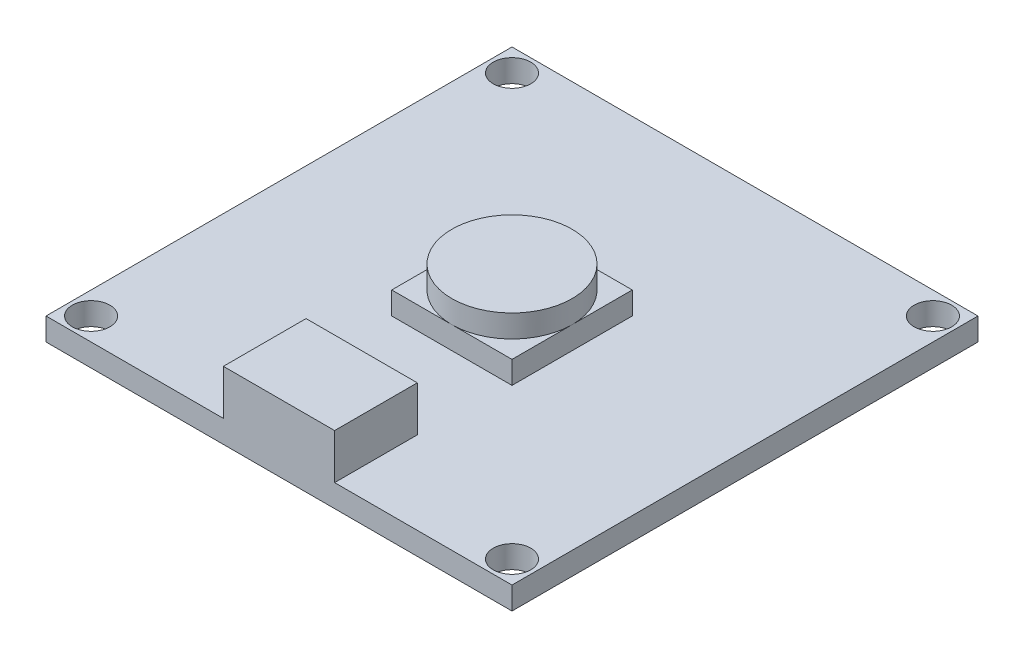
ISO-10303-21;
HEADER;
FILE_DESCRIPTION(('STEP AP214'),'2;1');
FILE_NAME('part.step','',(''),(''),'','','');
FILE_SCHEMA(('AUTOMOTIVE_DESIGN { 1 0 10303 214 1 1 1 1 }'));
ENDSEC;
DATA;
#1=APPLICATION_CONTEXT('core data for automotive mechanical design processes');
#2=APPLICATION_PROTOCOL_DEFINITION('international standard','automotive_design',2000,#1);
#3=PRODUCT_CONTEXT('',#1,'mechanical');
#4=PRODUCT('Part','Part','',(#3));
#5=PRODUCT_RELATED_PRODUCT_CATEGORY('part','',(#4));
#6=PRODUCT_DEFINITION_FORMATION('','',#4);
#7=PRODUCT_DEFINITION_CONTEXT('part definition',#1,'design');
#8=PRODUCT_DEFINITION('design','',#6,#7);
#9=PRODUCT_DEFINITION_SHAPE('','',#8);
#10=(LENGTH_UNIT() NAMED_UNIT(*) SI_UNIT(.MILLI.,.METRE.));
#11=(NAMED_UNIT(*) PLANE_ANGLE_UNIT() SI_UNIT($,.RADIAN.));
#12=(NAMED_UNIT(*) SI_UNIT($,.STERADIAN.) SOLID_ANGLE_UNIT());
#13=UNCERTAINTY_MEASURE_WITH_UNIT(LENGTH_MEASURE(1.E-05),#10,'distance_accuracy_value','');
#14=(GEOMETRIC_REPRESENTATION_CONTEXT(3) GLOBAL_UNCERTAINTY_ASSIGNED_CONTEXT((#13)) GLOBAL_UNIT_ASSIGNED_CONTEXT((#10,
#11,#12)) REPRESENTATION_CONTEXT('',''));
#15=CARTESIAN_POINT('',(0.,0.,0.));
#16=DIRECTION('',(0.,0.,1.));
#17=DIRECTION('',(1.,0.,0.));
#18=AXIS2_PLACEMENT_3D('',#15,#16,#17);
#19=CARTESIAN_POINT('',(0.,1.5,0.));
#20=DIRECTION('',(0.,-1.,0.));
#21=DIRECTION('',(0.,0.,-1.));
#22=AXIS2_PLACEMENT_3D('',#19,#20,#21);
#23=PLANE('',#22);
#24=CARTESIAN_POINT('',(-14.,1.5,14.));
#25=DIRECTION('',(0.,1.,0.));
#26=DIRECTION('',(0.,0.,1.));
#27=AXIS2_PLACEMENT_3D('',#24,#25,#26);
#28=CIRCLE('',#27,1.25);
#29=CARTESIAN_POINT('',(-14.,1.5,15.25));
#30=VERTEX_POINT('',#29);
#31=EDGE_CURVE('E347',#30,#30,#28,.T.);
#32=ORIENTED_EDGE('',*,*,#31,.F.);
#33=EDGE_LOOP('',(#32));
#34=FACE_BOUND('',#33,.T.);
#35=CARTESIAN_POINT('',(14.,1.5,14.));
#36=DIRECTION('',(0.,1.,0.));
#37=DIRECTION('',(0.,0.,1.));
#38=AXIS2_PLACEMENT_3D('',#35,#36,#37);
#39=CIRCLE('',#38,1.25);
#40=CARTESIAN_POINT('',(14.,1.5,15.25));
#41=VERTEX_POINT('',#40);
#42=EDGE_CURVE('E353',#41,#41,#39,.T.);
#43=ORIENTED_EDGE('',*,*,#42,.F.);
#44=EDGE_LOOP('',(#43));
#45=FACE_BOUND('',#44,.T.);
#46=CARTESIAN_POINT('',(14.,1.5,-14.));
#47=DIRECTION('',(0.,1.,0.));
#48=DIRECTION('',(0.,0.,1.));
#49=AXIS2_PLACEMENT_3D('',#46,#47,#48);
#50=CIRCLE('',#49,1.25);
#51=CARTESIAN_POINT('',(14.,1.5,-12.75));
#52=VERTEX_POINT('',#51);
#53=EDGE_CURVE('E359',#52,#52,#50,.T.);
#54=ORIENTED_EDGE('',*,*,#53,.F.);
#55=EDGE_LOOP('',(#54));
#56=FACE_BOUND('',#55,.T.);
#57=CARTESIAN_POINT('',(-14.,1.5,-14.));
#58=DIRECTION('',(0.,1.,0.));
#59=DIRECTION('',(0.,0.,1.));
#60=AXIS2_PLACEMENT_3D('',#57,#58,#59);
#61=CIRCLE('',#60,1.25);
#62=CARTESIAN_POINT('',(-14.,1.5,-12.75));
#63=VERTEX_POINT('',#62);
#64=EDGE_CURVE('E339',#63,#63,#61,.T.);
#65=ORIENTED_EDGE('',*,*,#64,.F.);
#66=EDGE_LOOP('',(#65));
#67=FACE_BOUND('',#66,.T.);
#68=DIRECTION('',(0.,0.,-1.));
#69=VECTOR('',#68,1.);
#70=CARTESIAN_POINT('',(4.,1.5,4.));
#71=LINE('',#70,#69);
#72=CARTESIAN_POINT('',(4.,1.5,4.));
#73=VERTEX_POINT('',#72);
#74=CARTESIAN_POINT('',(4.,1.5,-4.));
#75=VERTEX_POINT('',#74);
#76=EDGE_CURVE('E174',#73,#75,#71,.T.);
#77=ORIENTED_EDGE('',*,*,#76,.F.);
#78=DIRECTION('',(1.,0.,0.));
#79=VECTOR('',#78,1.);
#80=CARTESIAN_POINT('',(-4.,1.5,4.));
#81=LINE('',#80,#79);
#82=CARTESIAN_POINT('',(-4.,1.5,4.));
#83=VERTEX_POINT('',#82);
#84=EDGE_CURVE('E200',#83,#73,#81,.T.);
#85=ORIENTED_EDGE('',*,*,#84,.F.);
#86=DIRECTION('',(0.,0.,1.));
#87=VECTOR('',#86,1.);
#88=CARTESIAN_POINT('',(-4.,1.5,4.));
#89=LINE('',#88,#87);
#90=CARTESIAN_POINT('',(-4.,1.5,-4.));
#91=VERTEX_POINT('',#90);
#92=EDGE_CURVE('E197',#91,#83,#89,.T.);
#93=ORIENTED_EDGE('',*,*,#92,.F.);
#94=DIRECTION('',(-1.,0.,0.));
#95=VECTOR('',#94,1.);
#96=CARTESIAN_POINT('',(-4.,1.5,-4.));
#97=LINE('',#96,#95);
#98=EDGE_CURVE('E194',#75,#91,#97,.T.);
#99=ORIENTED_EDGE('',*,*,#98,.F.);
#100=EDGE_LOOP('',(#77,#85,#93,#99));
#101=FACE_BOUND('',#100,.T.);
#102=DIRECTION('',(0.,0.,-1.));
#103=VECTOR('',#102,1.);
#104=CARTESIAN_POINT('',(3.7,1.5,10.));
#105=LINE('',#104,#103);
#106=CARTESIAN_POINT('',(3.7,1.5,15.5));
#107=VERTEX_POINT('',#106);
#108=CARTESIAN_POINT('',(3.7,1.5,10.));
#109=VERTEX_POINT('',#108);
#110=EDGE_CURVE('E164',#107,#109,#105,.T.);
#111=ORIENTED_EDGE('',*,*,#110,.F.);
#112=DIRECTION('',(1.,0.,0.));
#113=VECTOR('',#112,1.);
#114=CARTESIAN_POINT('',(-15.5,1.5,15.5));
#115=LINE('',#114,#113);
#116=CARTESIAN_POINT('',(15.5,1.5,15.5));
#117=VERTEX_POINT('',#116);
#118=EDGE_CURVE('E223',#107,#117,#115,.T.);
#119=ORIENTED_EDGE('',*,*,#118,.T.);
#120=DIRECTION('',(0.,0.,-1.));
#121=VECTOR('',#120,1.);
#122=CARTESIAN_POINT('',(15.5,1.5,15.5));
#123=LINE('',#122,#121);
#124=CARTESIAN_POINT('',(15.5,1.5,-15.5));
#125=VERTEX_POINT('',#124);
#126=EDGE_CURVE('E215',#117,#125,#123,.T.);
#127=ORIENTED_EDGE('',*,*,#126,.T.);
#128=DIRECTION('',(-1.,0.,0.));
#129=VECTOR('',#128,1.);
#130=CARTESIAN_POINT('',(-15.5,1.5,-15.5));
#131=LINE('',#130,#129);
#132=CARTESIAN_POINT('',(-15.5,1.5,-15.5));
#133=VERTEX_POINT('',#132);
#134=EDGE_CURVE('E218',#125,#133,#131,.T.);
#135=ORIENTED_EDGE('',*,*,#134,.T.);
#136=DIRECTION('',(0.,0.,1.));
#137=VECTOR('',#136,1.);
#138=CARTESIAN_POINT('',(-15.5,1.5,15.5));
#139=LINE('',#138,#137);
#140=CARTESIAN_POINT('',(-15.5,1.5,15.5));
#141=VERTEX_POINT('',#140);
#142=EDGE_CURVE('E221',#133,#141,#139,.T.);
#143=ORIENTED_EDGE('',*,*,#142,.T.);
#144=CARTESIAN_POINT('',(-3.7,1.5,15.5));
#145=VERTEX_POINT('',#144);
#146=EDGE_CURVE('E224',#141,#145,#115,.T.);
#147=ORIENTED_EDGE('',*,*,#146,.T.);
#148=DIRECTION('',(0.,0.,1.));
#149=VECTOR('',#148,1.);
#150=CARTESIAN_POINT('',(-3.7,1.5,10.));
#151=LINE('',#150,#149);
#152=CARTESIAN_POINT('',(-3.7,1.5,10.));
#153=VERTEX_POINT('',#152);
#154=EDGE_CURVE('E63',#153,#145,#151,.T.);
#155=ORIENTED_EDGE('',*,*,#154,.F.);
#156=DIRECTION('',(-1.,0.,0.));
#157=VECTOR('',#156,1.);
#158=CARTESIAN_POINT('',(-3.7,1.5,10.));
#159=LINE('',#158,#157);
#160=EDGE_CURVE('E58',#109,#153,#159,.T.);
#161=ORIENTED_EDGE('',*,*,#160,.F.);
#162=EDGE_LOOP('',(#111,#119,#127,#135,#143,#147,#155,#161));
#163=FACE_BOUND('',#162,.T.);
#164=ADVANCED_FACE('F40',(#34,#45,#56,#67,#101,#163),#23,.F.);
#165=CARTESIAN_POINT('',(0.,3.,0.));
#166=DIRECTION('',(0.,-1.,0.));
#167=DIRECTION('',(0.,0.,-1.));
#168=AXIS2_PLACEMENT_3D('',#165,#166,#167);
#169=PLANE('',#168);
#170=CARTESIAN_POINT('',(0.,3.,0.));
#171=DIRECTION('',(0.,1.,0.));
#172=DIRECTION('',(0.,0.,1.));
#173=AXIS2_PLACEMENT_3D('',#170,#171,#172);
#174=CIRCLE('',#173,4.);
#175=CARTESIAN_POINT('',(0.,3.,4.));
#176=VERTEX_POINT('',#175);
#177=CARTESIAN_POINT('',(4.,3.,0.));
#178=VERTEX_POINT('',#177);
#179=EDGE_CURVE('E51',#176,#178,#174,.T.);
#180=ORIENTED_EDGE('',*,*,#179,.F.);
#181=DIRECTION('',(1.,0.,0.));
#182=VECTOR('',#181,1.);
#183=CARTESIAN_POINT('',(-4.,3.,4.));
#184=LINE('',#183,#182);
#185=CARTESIAN_POINT('',(4.,3.,4.));
#186=VERTEX_POINT('',#185);
#187=EDGE_CURVE('E188',#176,#186,#184,.T.);
#188=ORIENTED_EDGE('',*,*,#187,.T.);
#189=DIRECTION('',(0.,0.,-1.));
#190=VECTOR('',#189,1.);
#191=CARTESIAN_POINT('',(4.,3.,4.));
#192=LINE('',#191,#190);
#193=EDGE_CURVE('E176',#186,#178,#192,.T.);
#194=ORIENTED_EDGE('',*,*,#193,.T.);
#195=EDGE_LOOP('',(#180,#188,#194));
#196=FACE_BOUND('',#195,.T.);
#197=ADVANCED_FACE('F268',(#196),#169,.F.);
#198=CARTESIAN_POINT('',(0.,3.,-4.));
#199=VERTEX_POINT('',#198);
#200=EDGE_CURVE('E11',#178,#199,#174,.T.);
#201=ORIENTED_EDGE('',*,*,#200,.F.);
#202=CARTESIAN_POINT('',(4.,3.,-4.));
#203=VERTEX_POINT('',#202);
#204=EDGE_CURVE('E180',#178,#203,#192,.T.);
#205=ORIENTED_EDGE('',*,*,#204,.T.);
#206=DIRECTION('',(-1.,0.,0.));
#207=VECTOR('',#206,1.);
#208=CARTESIAN_POINT('',(-4.,3.,-4.));
#209=LINE('',#208,#207);
#210=EDGE_CURVE('E181',#203,#199,#209,.T.);
#211=ORIENTED_EDGE('',*,*,#210,.T.);
#212=EDGE_LOOP('',(#201,#205,#211));
#213=FACE_BOUND('',#212,.T.);
#214=ADVANCED_FACE('F261',(#213),#169,.F.);
#215=CARTESIAN_POINT('',(-4.,3.,0.));
#216=VERTEX_POINT('',#215);
#217=EDGE_CURVE('E49',#199,#216,#174,.T.);
#218=ORIENTED_EDGE('',*,*,#217,.F.);
#219=CARTESIAN_POINT('',(-4.,3.,-4.));
#220=VERTEX_POINT('',#219);
#221=EDGE_CURVE('E179',#199,#220,#209,.T.);
#222=ORIENTED_EDGE('',*,*,#221,.T.);
#223=DIRECTION('',(0.,0.,1.));
#224=VECTOR('',#223,1.);
#225=CARTESIAN_POINT('',(-4.,3.,4.));
#226=LINE('',#225,#224);
#227=EDGE_CURVE('E185',#220,#216,#226,.T.);
#228=ORIENTED_EDGE('',*,*,#227,.T.);
#229=EDGE_LOOP('',(#218,#222,#228));
#230=FACE_BOUND('',#229,.T.);
#231=ADVANCED_FACE('F253',(#230),#169,.F.);
#232=CARTESIAN_POINT('',(15.5,1.5,15.5));
#233=DIRECTION('',(-1.,0.,0.));
#234=DIRECTION('',(0.,0.,1.));
#235=AXIS2_PLACEMENT_3D('',#232,#233,#234);
#236=PLANE('',#235);
#237=DIRECTION('',(0.,0.,-1.));
#238=VECTOR('',#237,1.);
#239=CARTESIAN_POINT('',(15.5,0.,15.5));
#240=LINE('',#239,#238);
#241=CARTESIAN_POINT('',(15.5,0.,15.5));
#242=VERTEX_POINT('',#241);
#243=CARTESIAN_POINT('',(15.5,0.,-15.5));
#244=VERTEX_POINT('',#243);
#245=EDGE_CURVE('E214',#242,#244,#240,.T.);
#246=ORIENTED_EDGE('',*,*,#245,.T.);
#247=DIRECTION('',(0.,-1.,0.));
#248=VECTOR('',#247,1.);
#249=CARTESIAN_POINT('',(15.5,1.5,-15.5));
#250=LINE('',#249,#248);
#251=EDGE_CURVE('E44',#125,#244,#250,.T.);
#252=ORIENTED_EDGE('',*,*,#251,.F.);
#253=ORIENTED_EDGE('',*,*,#126,.F.);
#254=DIRECTION('',(0.,-1.,0.));
#255=VECTOR('',#254,1.);
#256=CARTESIAN_POINT('',(15.5,1.5,15.5));
#257=LINE('',#256,#255);
#258=EDGE_CURVE('E226',#117,#242,#257,.T.);
#259=ORIENTED_EDGE('',*,*,#258,.T.);
#260=EDGE_LOOP('',(#246,#252,#253,#259));
#261=FACE_BOUND('',#260,.T.);
#262=ADVANCED_FACE('F42',(#261),#236,.F.);
#263=CARTESIAN_POINT('',(-15.5,1.5,-15.5));
#264=DIRECTION('',(0.,0.,1.));
#265=DIRECTION('',(1.,0.,0.));
#266=AXIS2_PLACEMENT_3D('',#263,#264,#265);
#267=PLANE('',#266);
#268=DIRECTION('',(-1.,0.,0.));
#269=VECTOR('',#268,1.);
#270=CARTESIAN_POINT('',(-15.5,0.,-15.5));
#271=LINE('',#270,#269);
#272=CARTESIAN_POINT('',(-15.5,0.,-15.5));
#273=VERTEX_POINT('',#272);
#274=EDGE_CURVE('E229',#244,#273,#271,.T.);
#275=ORIENTED_EDGE('',*,*,#274,.T.);
#276=DIRECTION('',(0.,-1.,0.));
#277=VECTOR('',#276,1.);
#278=CARTESIAN_POINT('',(-15.5,1.5,-15.5));
#279=LINE('',#278,#277);
#280=EDGE_CURVE('E238',#133,#273,#279,.T.);
#281=ORIENTED_EDGE('',*,*,#280,.F.);
#282=ORIENTED_EDGE('',*,*,#134,.F.);
#283=ORIENTED_EDGE('',*,*,#251,.T.);
#284=EDGE_LOOP('',(#275,#281,#282,#283));
#285=FACE_BOUND('',#284,.T.);
#286=ADVANCED_FACE('F314',(#285),#267,.F.);
#287=CARTESIAN_POINT('',(-15.5,1.5,15.5));
#288=DIRECTION('',(1.,0.,0.));
#289=DIRECTION('',(0.,0.,-1.));
#290=AXIS2_PLACEMENT_3D('',#287,#288,#289);
#291=PLANE('',#290);
#292=DIRECTION('',(0.,0.,1.));
#293=VECTOR('',#292,1.);
#294=CARTESIAN_POINT('',(-15.5,0.,15.5));
#295=LINE('',#294,#293);
#296=CARTESIAN_POINT('',(-15.5,0.,15.5));
#297=VERTEX_POINT('',#296);
#298=EDGE_CURVE('E231',#273,#297,#295,.T.);
#299=ORIENTED_EDGE('',*,*,#298,.T.);
#300=DIRECTION('',(0.,-1.,0.));
#301=VECTOR('',#300,1.);
#302=CARTESIAN_POINT('',(-15.5,1.5,15.5));
#303=LINE('',#302,#301);
#304=EDGE_CURVE('E236',#141,#297,#303,.T.);
#305=ORIENTED_EDGE('',*,*,#304,.F.);
#306=ORIENTED_EDGE('',*,*,#142,.F.);
#307=ORIENTED_EDGE('',*,*,#280,.T.);
#308=EDGE_LOOP('',(#299,#305,#306,#307));
#309=FACE_BOUND('',#308,.T.);
#310=ADVANCED_FACE('F311',(#309),#291,.F.);
#311=CARTESIAN_POINT('',(-15.5,1.5,15.5));
#312=DIRECTION('',(0.,0.,-1.));
#313=DIRECTION('',(-1.,0.,0.));
#314=AXIS2_PLACEMENT_3D('',#311,#312,#313);
#315=PLANE('',#314);
#316=DIRECTION('',(1.,0.,0.));
#317=VECTOR('',#316,1.);
#318=CARTESIAN_POINT('',(-15.5,0.,15.5));
#319=LINE('',#318,#317);
#320=EDGE_CURVE('E219',#297,#242,#319,.T.);
#321=ORIENTED_EDGE('',*,*,#320,.T.);
#322=ORIENTED_EDGE('',*,*,#258,.F.);
#323=ORIENTED_EDGE('',*,*,#118,.F.);
#324=DIRECTION('',(0.,-1.,0.));
#325=VECTOR('',#324,1.);
#326=CARTESIAN_POINT('',(3.7,4.5,15.5));
#327=LINE('',#326,#325);
#328=CARTESIAN_POINT('',(3.7,4.5,15.5));
#329=VERTEX_POINT('',#328);
#330=EDGE_CURVE('E334',#329,#107,#327,.T.);
#331=ORIENTED_EDGE('',*,*,#330,.F.);
#332=DIRECTION('',(1.,0.,0.));
#333=VECTOR('',#332,1.);
#334=CARTESIAN_POINT('',(-3.7,4.5,15.5));
#335=LINE('',#334,#333);
#336=CARTESIAN_POINT('',(-3.7,4.5,15.5));
#337=VERTEX_POINT('',#336);
#338=EDGE_CURVE('E158',#337,#329,#335,.T.);
#339=ORIENTED_EDGE('',*,*,#338,.F.);
#340=DIRECTION('',(0.,-1.,0.));
#341=VECTOR('',#340,1.);
#342=CARTESIAN_POINT('',(-3.7,4.5,15.5));
#343=LINE('',#342,#341);
#344=EDGE_CURVE('E169',#337,#145,#343,.T.);
#345=ORIENTED_EDGE('',*,*,#344,.T.);
#346=ORIENTED_EDGE('',*,*,#146,.F.);
#347=ORIENTED_EDGE('',*,*,#304,.T.);
#348=EDGE_LOOP('',(#321,#322,#323,#331,#339,#345,#346,#347));
#349=FACE_BOUND('',#348,.T.);
#350=ADVANCED_FACE('F307',(#349),#315,.F.);
#351=CARTESIAN_POINT('',(0.,0.,0.));
#352=DIRECTION('',(0.,-1.,0.));
#353=DIRECTION('',(0.,0.,-1.));
#354=AXIS2_PLACEMENT_3D('',#351,#352,#353);
#355=PLANE('',#354);
#356=CARTESIAN_POINT('',(-14.,0.,14.));
#357=DIRECTION('',(0.,1.,0.));
#358=DIRECTION('',(0.,0.,1.));
#359=AXIS2_PLACEMENT_3D('',#356,#357,#358);
#360=CIRCLE('',#359,1.25);
#361=CARTESIAN_POINT('',(-14.,0.,15.25));
#362=VERTEX_POINT('',#361);
#363=EDGE_CURVE('E350',#362,#362,#360,.T.);
#364=ORIENTED_EDGE('',*,*,#363,.T.);
#365=EDGE_LOOP('',(#364));
#366=FACE_BOUND('',#365,.T.);
#367=CARTESIAN_POINT('',(14.,0.,14.));
#368=DIRECTION('',(0.,1.,0.));
#369=DIRECTION('',(0.,0.,1.));
#370=AXIS2_PLACEMENT_3D('',#367,#368,#369);
#371=CIRCLE('',#370,1.25);
#372=CARTESIAN_POINT('',(14.,0.,15.25));
#373=VERTEX_POINT('',#372);
#374=EDGE_CURVE('E356',#373,#373,#371,.T.);
#375=ORIENTED_EDGE('',*,*,#374,.T.);
#376=EDGE_LOOP('',(#375));
#377=FACE_BOUND('',#376,.T.);
#378=CARTESIAN_POINT('',(14.,0.,-14.));
#379=DIRECTION('',(0.,1.,0.));
#380=DIRECTION('',(0.,0.,1.));
#381=AXIS2_PLACEMENT_3D('',#378,#379,#380);
#382=CIRCLE('',#381,1.25);
#383=CARTESIAN_POINT('',(14.,0.,-12.75));
#384=VERTEX_POINT('',#383);
#385=EDGE_CURVE('E344',#384,#384,#382,.T.);
#386=ORIENTED_EDGE('',*,*,#385,.T.);
#387=EDGE_LOOP('',(#386));
#388=FACE_BOUND('',#387,.T.);
#389=CARTESIAN_POINT('',(-14.,0.,-14.));
#390=DIRECTION('',(0.,1.,0.));
#391=DIRECTION('',(0.,0.,1.));
#392=AXIS2_PLACEMENT_3D('',#389,#390,#391);
#393=CIRCLE('',#392,1.25);
#394=CARTESIAN_POINT('',(-14.,0.,-12.75));
#395=VERTEX_POINT('',#394);
#396=EDGE_CURVE('E337',#395,#395,#393,.T.);
#397=ORIENTED_EDGE('',*,*,#396,.T.);
#398=EDGE_LOOP('',(#397));
#399=FACE_BOUND('',#398,.T.);
#400=ORIENTED_EDGE('',*,*,#245,.F.);
#401=ORIENTED_EDGE('',*,*,#320,.F.);
#402=ORIENTED_EDGE('',*,*,#298,.F.);
#403=ORIENTED_EDGE('',*,*,#274,.F.);
#404=EDGE_LOOP('',(#400,#401,#402,#403));
#405=FACE_BOUND('',#404,.T.);
#406=ADVANCED_FACE('F305',(#366,#377,#388,#399,#405),#355,.T.);
#407=CARTESIAN_POINT('',(4.,3.,4.));
#408=DIRECTION('',(-1.,0.,0.));
#409=DIRECTION('',(0.,0.,1.));
#410=AXIS2_PLACEMENT_3D('',#407,#408,#409);
#411=PLANE('',#410);
#412=ORIENTED_EDGE('',*,*,#76,.T.);
#413=DIRECTION('',(0.,-1.,0.));
#414=VECTOR('',#413,1.);
#415=CARTESIAN_POINT('',(4.,3.,-4.));
#416=LINE('',#415,#414);
#417=EDGE_CURVE('E211',#203,#75,#416,.T.);
#418=ORIENTED_EDGE('',*,*,#417,.F.);
#419=ORIENTED_EDGE('',*,*,#204,.F.);
#420=ORIENTED_EDGE('',*,*,#193,.F.);
#421=DIRECTION('',(0.,-1.,0.));
#422=VECTOR('',#421,1.);
#423=CARTESIAN_POINT('',(4.,3.,4.));
#424=LINE('',#423,#422);
#425=EDGE_CURVE('E191',#186,#73,#424,.T.);
#426=ORIENTED_EDGE('',*,*,#425,.T.);
#427=EDGE_LOOP('',(#412,#418,#419,#420,#426));
#428=FACE_BOUND('',#427,.T.);
#429=ADVANCED_FACE('F265',(#428),#411,.F.);
#430=CARTESIAN_POINT('',(-4.,3.,-4.));
#431=DIRECTION('',(0.,0.,1.));
#432=DIRECTION('',(1.,0.,0.));
#433=AXIS2_PLACEMENT_3D('',#430,#431,#432);
#434=PLANE('',#433);
#435=ORIENTED_EDGE('',*,*,#98,.T.);
#436=DIRECTION('',(0.,-1.,0.));
#437=VECTOR('',#436,1.);
#438=CARTESIAN_POINT('',(-4.,3.,-4.));
#439=LINE('',#438,#437);
#440=EDGE_CURVE('E208',#220,#91,#439,.T.);
#441=ORIENTED_EDGE('',*,*,#440,.F.);
#442=ORIENTED_EDGE('',*,*,#221,.F.);
#443=ORIENTED_EDGE('',*,*,#210,.F.);
#444=ORIENTED_EDGE('',*,*,#417,.T.);
#445=EDGE_LOOP('',(#435,#441,#442,#443,#444));
#446=FACE_BOUND('',#445,.T.);
#447=ADVANCED_FACE('F258',(#446),#434,.F.);
#448=CARTESIAN_POINT('',(-4.,3.,4.));
#449=DIRECTION('',(1.,0.,0.));
#450=DIRECTION('',(0.,0.,-1.));
#451=AXIS2_PLACEMENT_3D('',#448,#449,#450);
#452=PLANE('',#451);
#453=ORIENTED_EDGE('',*,*,#92,.T.);
#454=DIRECTION('',(0.,-1.,0.));
#455=VECTOR('',#454,1.);
#456=CARTESIAN_POINT('',(-4.,3.,4.));
#457=LINE('',#456,#455);
#458=CARTESIAN_POINT('',(-4.,3.,4.));
#459=VERTEX_POINT('',#458);
#460=EDGE_CURVE('E205',#459,#83,#457,.T.);
#461=ORIENTED_EDGE('',*,*,#460,.F.);
#462=EDGE_CURVE('E184',#216,#459,#226,.T.);
#463=ORIENTED_EDGE('',*,*,#462,.F.);
#464=ORIENTED_EDGE('',*,*,#227,.F.);
#465=ORIENTED_EDGE('',*,*,#440,.T.);
#466=EDGE_LOOP('',(#453,#461,#463,#464,#465));
#467=FACE_BOUND('',#466,.T.);
#468=ADVANCED_FACE('F276',(#467),#452,.F.);
#469=CARTESIAN_POINT('',(-4.,3.,4.));
#470=DIRECTION('',(0.,0.,-1.));
#471=DIRECTION('',(-1.,0.,0.));
#472=AXIS2_PLACEMENT_3D('',#469,#470,#471);
#473=PLANE('',#472);
#474=ORIENTED_EDGE('',*,*,#84,.T.);
#475=ORIENTED_EDGE('',*,*,#425,.F.);
#476=ORIENTED_EDGE('',*,*,#187,.F.);
#477=EDGE_CURVE('E189',#459,#176,#184,.T.);
#478=ORIENTED_EDGE('',*,*,#477,.F.);
#479=ORIENTED_EDGE('',*,*,#460,.T.);
#480=EDGE_LOOP('',(#474,#475,#476,#478,#479));
#481=FACE_BOUND('',#480,.T.);
#482=ADVANCED_FACE('F273',(#481),#473,.F.);
#483=EDGE_CURVE('E168',#216,#176,#174,.T.);
#484=ORIENTED_EDGE('',*,*,#483,.F.);
#485=ORIENTED_EDGE('',*,*,#462,.T.);
#486=ORIENTED_EDGE('',*,*,#477,.T.);
#487=EDGE_LOOP('',(#484,#485,#486));
#488=FACE_BOUND('',#487,.T.);
#489=ADVANCED_FACE('F280',(#488),#169,.F.);
#490=CARTESIAN_POINT('',(0.,4.5,0.));
#491=DIRECTION('',(0.,-1.,0.));
#492=DIRECTION('',(0.,0.,-1.));
#493=AXIS2_PLACEMENT_3D('',#490,#491,#492);
#494=CYLINDRICAL_SURFACE('',#493,4.);
#495=CARTESIAN_POINT('',(0.,4.5,0.));
#496=DIRECTION('',(0.,1.,0.));
#497=DIRECTION('',(0.,0.,1.));
#498=AXIS2_PLACEMENT_3D('',#495,#496,#497);
#499=CIRCLE('',#498,4.);
#500=CARTESIAN_POINT('',(0.,4.5,4.));
#501=VERTEX_POINT('',#500);
#502=EDGE_CURVE('E167',#501,#501,#499,.T.);
#503=ORIENTED_EDGE('',*,*,#502,.F.);
#504=EDGE_LOOP('',(#503));
#505=FACE_BOUND('',#504,.T.);
#506=ORIENTED_EDGE('',*,*,#179,.T.);
#507=ORIENTED_EDGE('',*,*,#200,.T.);
#508=ORIENTED_EDGE('',*,*,#217,.T.);
#509=ORIENTED_EDGE('',*,*,#483,.T.);
#510=EDGE_LOOP('',(#506,#507,#508,#509));
#511=FACE_BOUND('',#510,.T.);
#512=ADVANCED_FACE('F250',(#505,#511),#494,.T.);
#513=CARTESIAN_POINT('',(0.,4.5,0.));
#514=DIRECTION('',(0.,1.,0.));
#515=DIRECTION('',(0.,0.,1.));
#516=AXIS2_PLACEMENT_3D('',#513,#514,#515);
#517=PLANE('',#516);
#518=ORIENTED_EDGE('',*,*,#502,.T.);
#519=EDGE_LOOP('',(#518));
#520=FACE_BOUND('',#519,.T.);
#521=ADVANCED_FACE('F287',(#520),#517,.T.);
#522=CARTESIAN_POINT('',(3.7,4.5,10.));
#523=DIRECTION('',(-1.,0.,0.));
#524=DIRECTION('',(0.,0.,1.));
#525=AXIS2_PLACEMENT_3D('',#522,#523,#524);
#526=PLANE('',#525);
#527=ORIENTED_EDGE('',*,*,#110,.T.);
#528=DIRECTION('',(0.,-1.,0.));
#529=VECTOR('',#528,1.);
#530=CARTESIAN_POINT('',(3.7,4.5,10.));
#531=LINE('',#530,#529);
#532=CARTESIAN_POINT('',(3.7,4.5,10.));
#533=VERTEX_POINT('',#532);
#534=EDGE_CURVE('E146',#533,#109,#531,.T.);
#535=ORIENTED_EDGE('',*,*,#534,.F.);
#536=DIRECTION('',(0.,0.,-1.));
#537=VECTOR('',#536,1.);
#538=CARTESIAN_POINT('',(3.7,4.5,10.));
#539=LINE('',#538,#537);
#540=EDGE_CURVE('E153',#329,#533,#539,.T.);
#541=ORIENTED_EDGE('',*,*,#540,.F.);
#542=ORIENTED_EDGE('',*,*,#330,.T.);
#543=EDGE_LOOP('',(#527,#535,#541,#542));
#544=FACE_BOUND('',#543,.T.);
#545=ADVANCED_FACE('F163',(#544),#526,.F.);
#546=CARTESIAN_POINT('',(-3.7,4.5,10.));
#547=DIRECTION('',(0.,0.,1.));
#548=DIRECTION('',(1.,0.,0.));
#549=AXIS2_PLACEMENT_3D('',#546,#547,#548);
#550=PLANE('',#549);
#551=ORIENTED_EDGE('',*,*,#160,.T.);
#552=DIRECTION('',(0.,-1.,0.));
#553=VECTOR('',#552,1.);
#554=CARTESIAN_POINT('',(-3.7,4.5,10.));
#555=LINE('',#554,#553);
#556=CARTESIAN_POINT('',(-3.7,4.5,10.));
#557=VERTEX_POINT('',#556);
#558=EDGE_CURVE('E149',#557,#153,#555,.T.);
#559=ORIENTED_EDGE('',*,*,#558,.F.);
#560=DIRECTION('',(-1.,0.,0.));
#561=VECTOR('',#560,1.);
#562=CARTESIAN_POINT('',(-3.7,4.5,10.));
#563=LINE('',#562,#561);
#564=EDGE_CURVE('E142',#533,#557,#563,.T.);
#565=ORIENTED_EDGE('',*,*,#564,.F.);
#566=ORIENTED_EDGE('',*,*,#534,.T.);
#567=EDGE_LOOP('',(#551,#559,#565,#566));
#568=FACE_BOUND('',#567,.T.);
#569=ADVANCED_FACE('F144',(#568),#550,.F.);
#570=CARTESIAN_POINT('',(-3.7,4.5,10.));
#571=DIRECTION('',(1.,0.,0.));
#572=DIRECTION('',(0.,0.,-1.));
#573=AXIS2_PLACEMENT_3D('',#570,#571,#572);
#574=PLANE('',#573);
#575=ORIENTED_EDGE('',*,*,#154,.T.);
#576=ORIENTED_EDGE('',*,*,#344,.F.);
#577=DIRECTION('',(0.,0.,1.));
#578=VECTOR('',#577,1.);
#579=CARTESIAN_POINT('',(-3.7,4.5,10.));
#580=LINE('',#579,#578);
#581=EDGE_CURVE('E152',#557,#337,#580,.T.);
#582=ORIENTED_EDGE('',*,*,#581,.F.);
#583=ORIENTED_EDGE('',*,*,#558,.T.);
#584=EDGE_LOOP('',(#575,#576,#582,#583));
#585=FACE_BOUND('',#584,.T.);
#586=ADVANCED_FACE('F329',(#585),#574,.F.);
#587=CARTESIAN_POINT('',(0.,4.5,0.));
#588=DIRECTION('',(0.,1.,0.));
#589=DIRECTION('',(0.,0.,1.));
#590=AXIS2_PLACEMENT_3D('',#587,#588,#589);
#591=PLANE('',#590);
#592=ORIENTED_EDGE('',*,*,#540,.T.);
#593=ORIENTED_EDGE('',*,*,#564,.T.);
#594=ORIENTED_EDGE('',*,*,#581,.T.);
#595=ORIENTED_EDGE('',*,*,#338,.T.);
#596=EDGE_LOOP('',(#592,#593,#594,#595));
#597=FACE_BOUND('',#596,.T.);
#598=ADVANCED_FACE('F156',(#597),#591,.T.);
#599=CARTESIAN_POINT('',(-14.,0.,-14.));
#600=DIRECTION('',(0.,1.,0.));
#601=DIRECTION('',(0.,0.,1.));
#602=AXIS2_PLACEMENT_3D('',#599,#600,#601);
#603=CYLINDRICAL_SURFACE('',#602,1.25);
#604=ORIENTED_EDGE('',*,*,#396,.F.);
#605=EDGE_LOOP('',(#604));
#606=FACE_BOUND('',#605,.T.);
#607=ORIENTED_EDGE('',*,*,#64,.T.);
#608=EDGE_LOOP('',(#607));
#609=FACE_BOUND('',#608,.T.);
#610=ADVANCED_FACE('F370',(#606,#609),#603,.F.);
#611=CARTESIAN_POINT('',(14.,0.,-14.));
#612=DIRECTION('',(0.,1.,0.));
#613=DIRECTION('',(0.,0.,1.));
#614=AXIS2_PLACEMENT_3D('',#611,#612,#613);
#615=CYLINDRICAL_SURFACE('',#614,1.25);
#616=ORIENTED_EDGE('',*,*,#385,.F.);
#617=EDGE_LOOP('',(#616));
#618=FACE_BOUND('',#617,.T.);
#619=ORIENTED_EDGE('',*,*,#53,.T.);
#620=EDGE_LOOP('',(#619));
#621=FACE_BOUND('',#620,.T.);
#622=ADVANCED_FACE('F366',(#618,#621),#615,.F.);
#623=CARTESIAN_POINT('',(14.,0.,14.));
#624=DIRECTION('',(0.,1.,0.));
#625=DIRECTION('',(0.,0.,1.));
#626=AXIS2_PLACEMENT_3D('',#623,#624,#625);
#627=CYLINDRICAL_SURFACE('',#626,1.25);
#628=ORIENTED_EDGE('',*,*,#374,.F.);
#629=EDGE_LOOP('',(#628));
#630=FACE_BOUND('',#629,.T.);
#631=ORIENTED_EDGE('',*,*,#42,.T.);
#632=EDGE_LOOP('',(#631));
#633=FACE_BOUND('',#632,.T.);
#634=ADVANCED_FACE('F369',(#630,#633),#627,.F.);
#635=CARTESIAN_POINT('',(-14.,0.,14.));
#636=DIRECTION('',(0.,1.,0.));
#637=DIRECTION('',(0.,0.,1.));
#638=AXIS2_PLACEMENT_3D('',#635,#636,#637);
#639=CYLINDRICAL_SURFACE('',#638,1.25);
#640=ORIENTED_EDGE('',*,*,#363,.F.);
#641=EDGE_LOOP('',(#640));
#642=FACE_BOUND('',#641,.T.);
#643=ORIENTED_EDGE('',*,*,#31,.T.);
#644=EDGE_LOOP('',(#643));
#645=FACE_BOUND('',#644,.T.);
#646=ADVANCED_FACE('F385',(#642,#645),#639,.F.);
#647=CLOSED_SHELL('',(#164,#197,#214,#231,#262,#286,#310,#350,#406,#429,#447,#468,#482,#489,
#512,#521,#545,#569,#586,#598,#610,#622,#634,#646));
#648=MANIFOLD_SOLID_BREP('B2',#647);
#649=ADVANCED_BREP_SHAPE_REPRESENTATION('',(#18,#648),#14);
#650=SHAPE_DEFINITION_REPRESENTATION(#9,#649);
ENDSEC;
END-ISO-10303-21;
